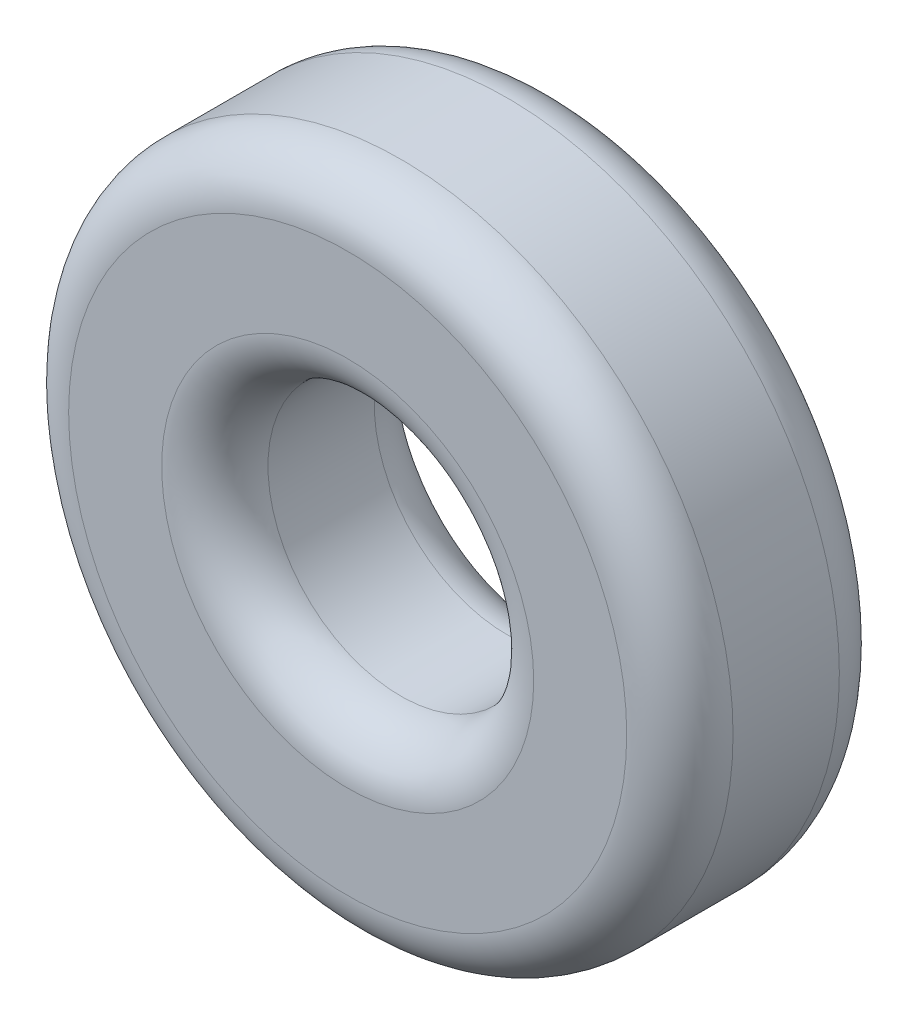
ISO-10303-21;
HEADER;
FILE_DESCRIPTION(('STEP AP214'),'2;1');
FILE_NAME('part.step','',(''),(''),'','','');
FILE_SCHEMA(('AUTOMOTIVE_DESIGN { 1 0 10303 214 1 1 1 1 }'));
ENDSEC;
DATA;
#1=APPLICATION_CONTEXT('core data for automotive mechanical design processes');
#2=APPLICATION_PROTOCOL_DEFINITION('international standard','automotive_design',2000,#1);
#3=PRODUCT_CONTEXT('',#1,'mechanical');
#4=PRODUCT('Part','Part','',(#3));
#5=PRODUCT_RELATED_PRODUCT_CATEGORY('part','',(#4));
#6=PRODUCT_DEFINITION_FORMATION('','',#4);
#7=PRODUCT_DEFINITION_CONTEXT('part definition',#1,'design');
#8=PRODUCT_DEFINITION('design','',#6,#7);
#9=PRODUCT_DEFINITION_SHAPE('','',#8);
#10=(LENGTH_UNIT() NAMED_UNIT(*) SI_UNIT(.MILLI.,.METRE.));
#11=(NAMED_UNIT(*) PLANE_ANGLE_UNIT() SI_UNIT($,.RADIAN.));
#12=(NAMED_UNIT(*) SI_UNIT($,.STERADIAN.) SOLID_ANGLE_UNIT());
#13=UNCERTAINTY_MEASURE_WITH_UNIT(LENGTH_MEASURE(1.E-05),#10,'distance_accuracy_value','');
#14=(GEOMETRIC_REPRESENTATION_CONTEXT(3) GLOBAL_UNCERTAINTY_ASSIGNED_CONTEXT((#13)) GLOBAL_UNIT_ASSIGNED_CONTEXT((#10,
#11,#12)) REPRESENTATION_CONTEXT('',''));
#15=CARTESIAN_POINT('',(0.,0.,0.));
#16=DIRECTION('',(0.,0.,1.));
#17=DIRECTION('',(1.,0.,0.));
#18=AXIS2_PLACEMENT_3D('',#15,#16,#17);
#19=CARTESIAN_POINT('',(0.,0.,8.));
#20=DIRECTION('',(0.,0.,1.));
#21=DIRECTION('',(1.,0.,0.));
#22=AXIS2_PLACEMENT_3D('',#19,#20,#21);
#23=PLANE('',#22);
#24=CARTESIAN_POINT('',(0.,0.,8.));
#25=DIRECTION('',(0.,0.,1.));
#26=DIRECTION('',(1.,0.,0.));
#27=AXIS2_PLACEMENT_3D('',#24,#25,#26);
#28=CIRCLE('',#27,7.);
#29=CARTESIAN_POINT('',(7.,0.,8.));
#30=VERTEX_POINT('',#29);
#31=EDGE_CURVE('E42',#30,#30,#28,.F.);
#32=ORIENTED_EDGE('',*,*,#31,.T.);
#33=EDGE_LOOP('',(#32));
#34=FACE_BOUND('',#33,.T.);
#35=CARTESIAN_POINT('',(0.,0.,8.));
#36=DIRECTION('',(0.,0.,1.));
#37=DIRECTION('',(1.,0.,0.));
#38=AXIS2_PLACEMENT_3D('',#35,#36,#37);
#39=CIRCLE('',#38,10.5);
#40=CARTESIAN_POINT('',(10.5,0.,8.));
#41=VERTEX_POINT('',#40);
#42=EDGE_CURVE('E46',#41,#41,#39,.T.);
#43=ORIENTED_EDGE('',*,*,#42,.T.);
#44=EDGE_LOOP('',(#43));
#45=FACE_BOUND('',#44,.T.);
#46=ADVANCED_FACE('F31',(#34,#45),#23,.T.);
#47=CARTESIAN_POINT('',(0.,0.,0.));
#48=DIRECTION('',(0.,0.,1.));
#49=DIRECTION('',(1.,0.,0.));
#50=AXIS2_PLACEMENT_3D('',#47,#48,#49);
#51=PLANE('',#50);
#52=CARTESIAN_POINT('',(0.,0.,0.));
#53=DIRECTION('',(0.,0.,1.));
#54=DIRECTION('',(1.,0.,0.));
#55=AXIS2_PLACEMENT_3D('',#52,#53,#54);
#56=CIRCLE('',#55,7.);
#57=CARTESIAN_POINT('',(7.,0.,0.));
#58=VERTEX_POINT('',#57);
#59=EDGE_CURVE('E57',#58,#58,#56,.T.);
#60=ORIENTED_EDGE('',*,*,#59,.T.);
#61=EDGE_LOOP('',(#60));
#62=FACE_BOUND('',#61,.T.);
#63=CARTESIAN_POINT('',(0.,0.,0.));
#64=DIRECTION('',(0.,0.,1.));
#65=DIRECTION('',(1.,0.,0.));
#66=AXIS2_PLACEMENT_3D('',#63,#64,#65);
#67=CIRCLE('',#66,10.5);
#68=CARTESIAN_POINT('',(10.5,0.,0.));
#69=VERTEX_POINT('',#68);
#70=EDGE_CURVE('E60',#69,#69,#67,.F.);
#71=ORIENTED_EDGE('',*,*,#70,.T.);
#72=EDGE_LOOP('',(#71));
#73=FACE_BOUND('',#72,.T.);
#74=ADVANCED_FACE('F64',(#62,#73),#51,.F.);
#75=CARTESIAN_POINT('',(0.,0.,8.));
#76=DIRECTION('',(0.,0.,-1.));
#77=DIRECTION('',(-1.,0.,0.));
#78=AXIS2_PLACEMENT_3D('',#75,#76,#77);
#79=CYLINDRICAL_SURFACE('',#78,12.5);
#80=CARTESIAN_POINT('',(0.,0.,2.));
#81=DIRECTION('',(0.,0.,1.));
#82=DIRECTION('',(1.,0.,0.));
#83=AXIS2_PLACEMENT_3D('',#80,#81,#82);
#84=CIRCLE('',#83,12.5);
#85=CARTESIAN_POINT('',(12.5,0.,2.));
#86=VERTEX_POINT('',#85);
#87=EDGE_CURVE('E10',#86,#86,#84,.T.);
#88=ORIENTED_EDGE('',*,*,#87,.T.);
#89=EDGE_LOOP('',(#88));
#90=FACE_BOUND('',#89,.T.);
#91=CARTESIAN_POINT('',(0.,0.,6.));
#92=DIRECTION('',(0.,0.,1.));
#93=DIRECTION('',(1.,0.,0.));
#94=AXIS2_PLACEMENT_3D('',#91,#92,#93);
#95=CIRCLE('',#94,12.5);
#96=CARTESIAN_POINT('',(12.5,0.,6.));
#97=VERTEX_POINT('',#96);
#98=EDGE_CURVE('E38',#97,#97,#95,.F.);
#99=ORIENTED_EDGE('',*,*,#98,.T.);
#100=EDGE_LOOP('',(#99));
#101=FACE_BOUND('',#100,.T.);
#102=ADVANCED_FACE('F84',(#90,#101),#79,.T.);
#103=CARTESIAN_POINT('',(0.,0.,8.));
#104=DIRECTION('',(0.,0.,-1.));
#105=DIRECTION('',(-1.,0.,0.));
#106=AXIS2_PLACEMENT_3D('',#103,#104,#105);
#107=CYLINDRICAL_SURFACE('',#106,5.);
#108=CARTESIAN_POINT('',(0.,0.,2.));
#109=DIRECTION('',(0.,0.,1.));
#110=DIRECTION('',(1.,0.,0.));
#111=AXIS2_PLACEMENT_3D('',#108,#109,#110);
#112=CIRCLE('',#111,5.);
#113=CARTESIAN_POINT('',(5.,0.,2.));
#114=VERTEX_POINT('',#113);
#115=EDGE_CURVE('E51',#114,#114,#112,.F.);
#116=ORIENTED_EDGE('',*,*,#115,.T.);
#117=EDGE_LOOP('',(#116));
#118=FACE_BOUND('',#117,.T.);
#119=CARTESIAN_POINT('',(0.,0.,6.));
#120=DIRECTION('',(0.,0.,1.));
#121=DIRECTION('',(1.,0.,0.));
#122=AXIS2_PLACEMENT_3D('',#119,#120,#121);
#123=CIRCLE('',#122,5.);
#124=CARTESIAN_POINT('',(5.,0.,6.));
#125=VERTEX_POINT('',#124);
#126=EDGE_CURVE('E54',#125,#125,#123,.T.);
#127=ORIENTED_EDGE('',*,*,#126,.T.);
#128=EDGE_LOOP('',(#127));
#129=FACE_BOUND('',#128,.T.);
#130=ADVANCED_FACE('F89',(#118,#129),#107,.F.);
#131=CARTESIAN_POINT('',(0.,0.,2.));
#132=DIRECTION('',(0.,0.,1.));
#133=DIRECTION('',(1.,0.,0.));
#134=AXIS2_PLACEMENT_3D('',#131,#132,#133);
#135=TOROIDAL_SURFACE('',#134,7.,2.);
#136=ORIENTED_EDGE('',*,*,#115,.F.);
#137=EDGE_LOOP('',(#136));
#138=FACE_BOUND('',#137,.T.);
#139=ORIENTED_EDGE('',*,*,#59,.F.);
#140=EDGE_LOOP('',(#139));
#141=FACE_BOUND('',#140,.T.);
#142=ADVANCED_FACE('F75',(#138,#141),#135,.T.);
#143=CARTESIAN_POINT('',(0.,0.,6.));
#144=DIRECTION('',(0.,0.,1.));
#145=DIRECTION('',(1.,0.,0.));
#146=AXIS2_PLACEMENT_3D('',#143,#144,#145);
#147=TOROIDAL_SURFACE('',#146,7.,2.);
#148=ORIENTED_EDGE('',*,*,#31,.F.);
#149=EDGE_LOOP('',(#148));
#150=FACE_BOUND('',#149,.T.);
#151=ORIENTED_EDGE('',*,*,#126,.F.);
#152=EDGE_LOOP('',(#151));
#153=FACE_BOUND('',#152,.T.);
#154=ADVANCED_FACE('F69',(#150,#153),#147,.T.);
#155=CARTESIAN_POINT('',(0.,0.,2.));
#156=DIRECTION('',(0.,0.,1.));
#157=DIRECTION('',(1.,0.,0.));
#158=AXIS2_PLACEMENT_3D('',#155,#156,#157);
#159=TOROIDAL_SURFACE('',#158,10.5,2.);
#160=ORIENTED_EDGE('',*,*,#70,.F.);
#161=EDGE_LOOP('',(#160));
#162=FACE_BOUND('',#161,.T.);
#163=ORIENTED_EDGE('',*,*,#87,.F.);
#164=EDGE_LOOP('',(#163));
#165=FACE_BOUND('',#164,.T.);
#166=ADVANCED_FACE('F66',(#162,#165),#159,.T.);
#167=CARTESIAN_POINT('',(0.,0.,6.));
#168=DIRECTION('',(0.,0.,1.));
#169=DIRECTION('',(1.,0.,0.));
#170=AXIS2_PLACEMENT_3D('',#167,#168,#169);
#171=TOROIDAL_SURFACE('',#170,10.5,2.);
#172=ORIENTED_EDGE('',*,*,#98,.F.);
#173=EDGE_LOOP('',(#172));
#174=FACE_BOUND('',#173,.T.);
#175=ORIENTED_EDGE('',*,*,#42,.F.);
#176=EDGE_LOOP('',(#175));
#177=FACE_BOUND('',#176,.T.);
#178=ADVANCED_FACE('F33',(#174,#177),#171,.T.);
#179=CLOSED_SHELL('',(#46,#74,#102,#130,#142,#154,#166,#178));
#180=MANIFOLD_SOLID_BREP('B2',#179);
#181=ADVANCED_BREP_SHAPE_REPRESENTATION('',(#18,#180),#14);
#182=SHAPE_DEFINITION_REPRESENTATION(#9,#181);
ENDSEC;
END-ISO-10303-21;
